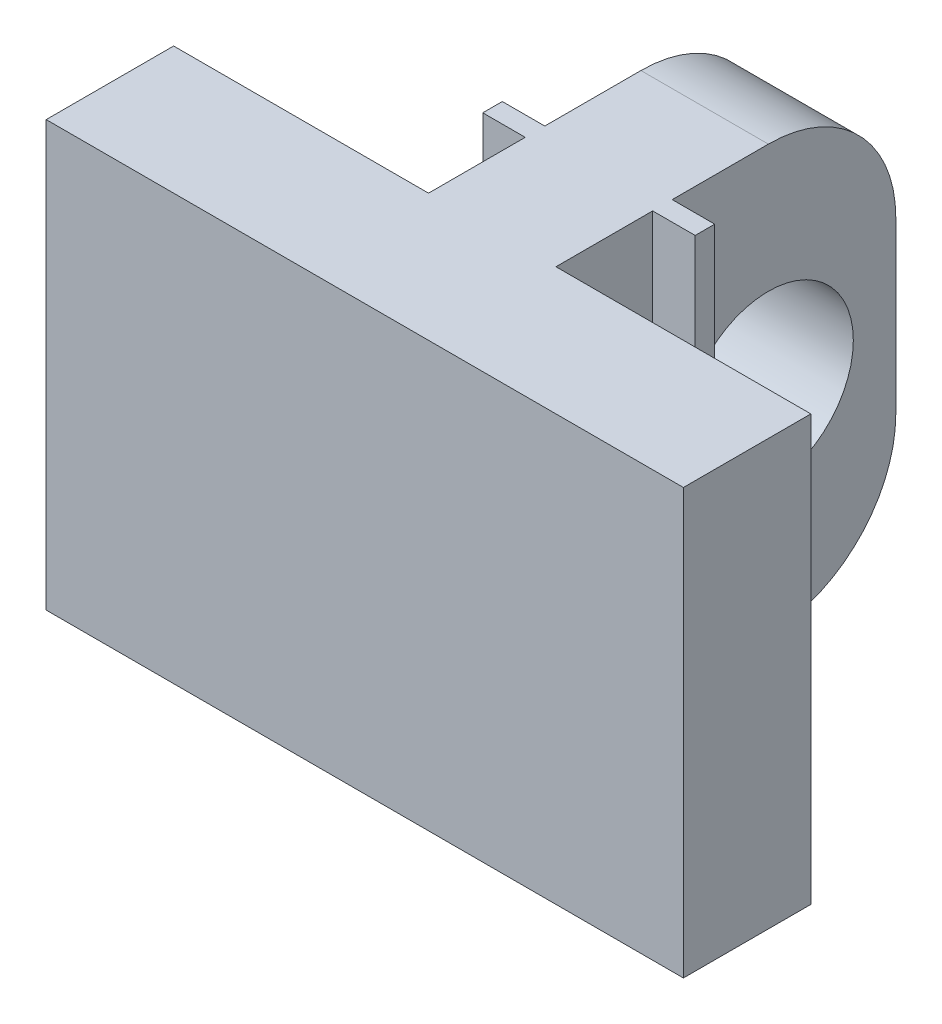
ISO-10303-21;
HEADER;
FILE_DESCRIPTION(('STEP AP214'),'2;1');
FILE_NAME('part.step','',(''),(''),'','','');
FILE_SCHEMA(('AUTOMOTIVE_DESIGN { 1 0 10303 214 1 1 1 1 }'));
ENDSEC;
DATA;
#1=APPLICATION_CONTEXT('core data for automotive mechanical design processes');
#2=APPLICATION_PROTOCOL_DEFINITION('international standard','automotive_design',2000,#1);
#3=PRODUCT_CONTEXT('',#1,'mechanical');
#4=PRODUCT('Part','Part','',(#3));
#5=PRODUCT_RELATED_PRODUCT_CATEGORY('part','',(#4));
#6=PRODUCT_DEFINITION_FORMATION('','',#4);
#7=PRODUCT_DEFINITION_CONTEXT('part definition',#1,'design');
#8=PRODUCT_DEFINITION('design','',#6,#7);
#9=PRODUCT_DEFINITION_SHAPE('','',#8);
#10=(LENGTH_UNIT() NAMED_UNIT(*) SI_UNIT(.MILLI.,.METRE.));
#11=(NAMED_UNIT(*) PLANE_ANGLE_UNIT() SI_UNIT($,.RADIAN.));
#12=(NAMED_UNIT(*) SI_UNIT($,.STERADIAN.) SOLID_ANGLE_UNIT());
#13=UNCERTAINTY_MEASURE_WITH_UNIT(LENGTH_MEASURE(1.E-05),#10,'distance_accuracy_value','');
#14=(GEOMETRIC_REPRESENTATION_CONTEXT(3) GLOBAL_UNCERTAINTY_ASSIGNED_CONTEXT((#13)) GLOBAL_UNIT_ASSIGNED_CONTEXT((#10,
#11,#12)) REPRESENTATION_CONTEXT('',''));
#15=CARTESIAN_POINT('',(0.,0.,0.));
#16=DIRECTION('',(0.,0.,1.));
#17=DIRECTION('',(1.,0.,0.));
#18=AXIS2_PLACEMENT_3D('',#15,#16,#17);
#19=CARTESIAN_POINT('',(1.5,10.,0.));
#20=DIRECTION('',(1.,0.,0.));
#21=DIRECTION('',(0.,0.,-1.));
#22=AXIS2_PLACEMENT_3D('',#19,#20,#21);
#23=PLANE('',#22);
#24=DIRECTION('',(0.,1.,0.));
#25=VECTOR('',#24,1.);
#26=CARTESIAN_POINT('',(1.5,10.,-2.422407419715));
#27=LINE('',#26,#25);
#28=CARTESIAN_POINT('',(1.5,0.,-2.422407419715));
#29=VERTEX_POINT('',#28);
#30=CARTESIAN_POINT('',(1.5,10.,-2.422407419715));
#31=VERTEX_POINT('',#30);
#32=EDGE_CURVE('E166',#29,#31,#27,.T.);
#33=ORIENTED_EDGE('',*,*,#32,.F.);
#34=DIRECTION('',(0.,0.,1.));
#35=VECTOR('',#34,1.);
#36=CARTESIAN_POINT('',(1.5,0.,0.));
#37=LINE('',#36,#35);
#38=CARTESIAN_POINT('',(1.5,0.,-4.68567639257295));
#39=VERTEX_POINT('',#38);
#40=EDGE_CURVE('E246',#39,#29,#37,.T.);
#41=ORIENTED_EDGE('',*,*,#40,.F.);
#42=CARTESIAN_POINT('',(1.5,3.,-4.68567639257295));
#43=DIRECTION('',(1.,0.,0.));
#44=DIRECTION('',(0.,0.,-1.));
#45=AXIS2_PLACEMENT_3D('',#42,#43,#44);
#46=CIRCLE('',#45,3.);
#47=CARTESIAN_POINT('',(1.5,3.,-7.68567639257295));
#48=VERTEX_POINT('',#47);
#49=EDGE_CURVE('E282',#39,#48,#46,.T.);
#50=ORIENTED_EDGE('',*,*,#49,.T.);
#51=DIRECTION('',(0.,-1.,0.));
#52=VECTOR('',#51,1.);
#53=CARTESIAN_POINT('',(1.5,10.,-7.68567639257295));
#54=LINE('',#53,#52);
#55=CARTESIAN_POINT('',(1.5,7.,-7.68567639257295));
#56=VERTEX_POINT('',#55);
#57=EDGE_CURVE('E269',#56,#48,#54,.T.);
#58=ORIENTED_EDGE('',*,*,#57,.F.);
#59=CARTESIAN_POINT('',(1.5,7.,-4.68567639257295));
#60=DIRECTION('',(1.,0.,0.));
#61=DIRECTION('',(0.,0.,-1.));
#62=AXIS2_PLACEMENT_3D('',#59,#60,#61);
#63=CIRCLE('',#62,3.);
#64=CARTESIAN_POINT('',(1.5,10.,-4.68567639257295));
#65=VERTEX_POINT('',#64);
#66=EDGE_CURVE('E280',#56,#65,#63,.T.);
#67=ORIENTED_EDGE('',*,*,#66,.T.);
#68=DIRECTION('',(0.,0.,1.));
#69=VECTOR('',#68,1.);
#70=CARTESIAN_POINT('',(1.5,10.,0.));
#71=LINE('',#70,#69);
#72=EDGE_CURVE('E59',#65,#31,#71,.T.);
#73=ORIENTED_EDGE('',*,*,#72,.T.);
#74=EDGE_LOOP('',(#33,#41,#50,#58,#67,#73));
#75=FACE_BOUND('',#74,.T.);
#76=CARTESIAN_POINT('',(1.5,5.,-4.68567639257295));
#77=DIRECTION('',(1.,0.,0.));
#78=DIRECTION('',(0.,0.,-1.));
#79=AXIS2_PLACEMENT_3D('',#76,#77,#78);
#80=CIRCLE('',#79,2.);
#81=CARTESIAN_POINT('',(1.5,5.,-6.68567639257295));
#82=VERTEX_POINT('',#81);
#83=EDGE_CURVE('E216',#82,#82,#80,.T.);
#84=ORIENTED_EDGE('',*,*,#83,.F.);
#85=EDGE_LOOP('',(#84));
#86=FACE_BOUND('',#85,.T.);
#87=ADVANCED_FACE('F35',(#75,#86),#23,.T.);
#88=CARTESIAN_POINT('',(-1.5,10.,0.));
#89=DIRECTION('',(1.,0.,0.));
#90=DIRECTION('',(0.,0.,-1.));
#91=AXIS2_PLACEMENT_3D('',#88,#89,#90);
#92=PLANE('',#91);
#93=CARTESIAN_POINT('',(-1.5,5.,-4.68567639257294));
#94=DIRECTION('',(1.,0.,0.));
#95=DIRECTION('',(0.,0.,-1.));
#96=AXIS2_PLACEMENT_3D('',#93,#94,#95);
#97=CIRCLE('',#96,2.);
#98=CARTESIAN_POINT('',(-1.5,5.,-6.68567639257294));
#99=VERTEX_POINT('',#98);
#100=EDGE_CURVE('E39',#99,#99,#97,.T.);
#101=ORIENTED_EDGE('',*,*,#100,.T.);
#102=EDGE_LOOP('',(#101));
#103=FACE_BOUND('',#102,.T.);
#104=DIRECTION('',(0.,0.,1.));
#105=VECTOR('',#104,1.);
#106=CARTESIAN_POINT('',(-1.5,0.,0.));
#107=LINE('',#106,#105);
#108=CARTESIAN_POINT('',(-1.5,0.,-4.68567639257295));
#109=VERTEX_POINT('',#108);
#110=CARTESIAN_POINT('',(-1.5,0.,-2.422407419715));
#111=VERTEX_POINT('',#110);
#112=EDGE_CURVE('E250',#109,#111,#107,.T.);
#113=ORIENTED_EDGE('',*,*,#112,.T.);
#114=DIRECTION('',(0.,1.,0.));
#115=VECTOR('',#114,1.);
#116=CARTESIAN_POINT('',(-1.5,10.,-2.422407419715));
#117=LINE('',#116,#115);
#118=CARTESIAN_POINT('',(-1.5,10.,-2.422407419715));
#119=VERTEX_POINT('',#118);
#120=EDGE_CURVE('E212',#111,#119,#117,.T.);
#121=ORIENTED_EDGE('',*,*,#120,.T.);
#122=DIRECTION('',(0.,0.,1.));
#123=VECTOR('',#122,1.);
#124=CARTESIAN_POINT('',(-1.5,10.,0.));
#125=LINE('',#124,#123);
#126=CARTESIAN_POINT('',(-1.5,10.,-4.68567639257295));
#127=VERTEX_POINT('',#126);
#128=EDGE_CURVE('E230',#127,#119,#125,.T.);
#129=ORIENTED_EDGE('',*,*,#128,.F.);
#130=CARTESIAN_POINT('',(-1.5,7.,-4.68567639257295));
#131=DIRECTION('',(1.,0.,0.));
#132=DIRECTION('',(0.,0.,-1.));
#133=AXIS2_PLACEMENT_3D('',#130,#131,#132);
#134=CIRCLE('',#133,3.);
#135=CARTESIAN_POINT('',(-1.5,7.,-7.68567639257295));
#136=VERTEX_POINT('',#135);
#137=EDGE_CURVE('E289',#127,#136,#134,.F.);
#138=ORIENTED_EDGE('',*,*,#137,.T.);
#139=DIRECTION('',(0.,-1.,0.));
#140=VECTOR('',#139,1.);
#141=CARTESIAN_POINT('',(-1.5,10.,-7.68567639257295));
#142=LINE('',#141,#140);
#143=CARTESIAN_POINT('',(-1.5,3.,-7.68567639257295));
#144=VERTEX_POINT('',#143);
#145=EDGE_CURVE('E266',#136,#144,#142,.T.);
#146=ORIENTED_EDGE('',*,*,#145,.T.);
#147=CARTESIAN_POINT('',(-1.5,3.,-4.68567639257295));
#148=DIRECTION('',(1.,0.,0.));
#149=DIRECTION('',(0.,0.,-1.));
#150=AXIS2_PLACEMENT_3D('',#147,#148,#149);
#151=CIRCLE('',#150,3.);
#152=EDGE_CURVE('E44',#144,#109,#151,.F.);
#153=ORIENTED_EDGE('',*,*,#152,.T.);
#154=EDGE_LOOP('',(#113,#121,#129,#138,#146,#153));
#155=FACE_BOUND('',#154,.T.);
#156=ADVANCED_FACE('F294',(#103,#155),#92,.F.);
#157=CARTESIAN_POINT('',(7.5,10.,0.));
#158=DIRECTION('',(1.,0.,0.));
#159=DIRECTION('',(0.,0.,-1.));
#160=AXIS2_PLACEMENT_3D('',#157,#158,#159);
#161=PLANE('',#160);
#162=DIRECTION('',(0.,0.,1.));
#163=VECTOR('',#162,1.);
#164=CARTESIAN_POINT('',(7.5,0.,0.));
#165=LINE('',#164,#163);
#166=CARTESIAN_POINT('',(7.5,0.,0.314323607427055));
#167=VERTEX_POINT('',#166);
#168=CARTESIAN_POINT('',(7.5,0.,3.31432360742705));
#169=VERTEX_POINT('',#168);
#170=EDGE_CURVE('E238',#167,#169,#165,.T.);
#171=ORIENTED_EDGE('',*,*,#170,.F.);
#172=DIRECTION('',(0.,-1.,0.));
#173=VECTOR('',#172,1.);
#174=CARTESIAN_POINT('',(7.5,10.,0.314323607427055));
#175=LINE('',#174,#173);
#176=CARTESIAN_POINT('',(7.5,10.,0.314323607427055));
#177=VERTEX_POINT('',#176);
#178=EDGE_CURVE('E275',#177,#167,#175,.T.);
#179=ORIENTED_EDGE('',*,*,#178,.F.);
#180=DIRECTION('',(0.,0.,1.));
#181=VECTOR('',#180,1.);
#182=CARTESIAN_POINT('',(7.5,10.,0.));
#183=LINE('',#182,#181);
#184=CARTESIAN_POINT('',(7.5,10.,3.31432360742705));
#185=VERTEX_POINT('',#184);
#186=EDGE_CURVE('E219',#177,#185,#183,.T.);
#187=ORIENTED_EDGE('',*,*,#186,.T.);
#188=DIRECTION('',(0.,-1.,0.));
#189=VECTOR('',#188,1.);
#190=CARTESIAN_POINT('',(7.5,10.,3.31432360742705));
#191=LINE('',#190,#189);
#192=EDGE_CURVE('E237',#185,#169,#191,.T.);
#193=ORIENTED_EDGE('',*,*,#192,.T.);
#194=EDGE_LOOP('',(#171,#179,#187,#193));
#195=FACE_BOUND('',#194,.T.);
#196=ADVANCED_FACE('F357',(#195),#161,.T.);
#197=CARTESIAN_POINT('',(0.,10.,0.314323607427055));
#198=DIRECTION('',(0.,0.,-1.));
#199=DIRECTION('',(-1.,0.,0.));
#200=AXIS2_PLACEMENT_3D('',#197,#198,#199);
#201=PLANE('',#200);
#202=DIRECTION('',(1.,0.,0.));
#203=VECTOR('',#202,1.);
#204=CARTESIAN_POINT('',(0.,0.,0.314323607427055));
#205=LINE('',#204,#203);
#206=CARTESIAN_POINT('',(1.5,0.,0.314323607427055));
#207=VERTEX_POINT('',#206);
#208=EDGE_CURVE('E241',#207,#167,#205,.T.);
#209=ORIENTED_EDGE('',*,*,#208,.F.);
#210=DIRECTION('',(0.,-1.,0.));
#211=VECTOR('',#210,1.);
#212=CARTESIAN_POINT('',(1.5,10.,0.314323607427055));
#213=LINE('',#212,#211);
#214=CARTESIAN_POINT('',(1.5,10.,0.314323607427055));
#215=VERTEX_POINT('',#214);
#216=EDGE_CURVE('E272',#215,#207,#213,.T.);
#217=ORIENTED_EDGE('',*,*,#216,.F.);
#218=DIRECTION('',(1.,0.,0.));
#219=VECTOR('',#218,1.);
#220=CARTESIAN_POINT('',(0.,10.,0.314323607427055));
#221=LINE('',#220,#219);
#222=EDGE_CURVE('E222',#215,#177,#221,.T.);
#223=ORIENTED_EDGE('',*,*,#222,.T.);
#224=ORIENTED_EDGE('',*,*,#178,.T.);
#225=EDGE_LOOP('',(#209,#217,#223,#224));
#226=FACE_BOUND('',#225,.T.);
#227=ADVANCED_FACE('F349',(#226),#201,.T.);
#228=DIRECTION('',(0.,-1.,0.));
#229=VECTOR('',#228,1.);
#230=CARTESIAN_POINT('',(1.5,10.,-1.9623538486826));
#231=LINE('',#230,#229);
#232=CARTESIAN_POINT('',(1.5,10.,-1.9623538486826));
#233=VERTEX_POINT('',#232);
#234=CARTESIAN_POINT('',(1.5,0.,-1.9623538486826));
#235=VERTEX_POINT('',#234);
#236=EDGE_CURVE('E209',#233,#235,#231,.T.);
#237=ORIENTED_EDGE('',*,*,#236,.F.);
#238=EDGE_CURVE('E226',#233,#215,#71,.T.);
#239=ORIENTED_EDGE('',*,*,#238,.T.);
#240=ORIENTED_EDGE('',*,*,#216,.T.);
#241=EDGE_CURVE('E244',#235,#207,#37,.T.);
#242=ORIENTED_EDGE('',*,*,#241,.F.);
#243=EDGE_LOOP('',(#237,#239,#240,#242));
#244=FACE_BOUND('',#243,.T.);
#245=ADVANCED_FACE('F353',(#244),#23,.T.);
#246=CARTESIAN_POINT('',(0.,10.,-7.68567639257295));
#247=DIRECTION('',(0.,0.,-1.));
#248=DIRECTION('',(-1.,0.,0.));
#249=AXIS2_PLACEMENT_3D('',#246,#247,#248);
#250=PLANE('',#249);
#251=ORIENTED_EDGE('',*,*,#57,.T.);
#252=DIRECTION('',(1.,0.,0.));
#253=VECTOR('',#252,1.);
#254=CARTESIAN_POINT('',(-1.5,3.,-7.68567639257295));
#255=LINE('',#254,#253);
#256=EDGE_CURVE('E287',#48,#144,#255,.F.);
#257=ORIENTED_EDGE('',*,*,#256,.T.);
#258=ORIENTED_EDGE('',*,*,#145,.F.);
#259=DIRECTION('',(1.,0.,0.));
#260=VECTOR('',#259,1.);
#261=CARTESIAN_POINT('',(0.,7.,-7.68567639257295));
#262=LINE('',#261,#260);
#263=EDGE_CURVE('E284',#136,#56,#262,.T.);
#264=ORIENTED_EDGE('',*,*,#263,.T.);
#265=EDGE_LOOP('',(#251,#257,#258,#264));
#266=FACE_BOUND('',#265,.T.);
#267=ADVANCED_FACE('F307',(#266),#250,.T.);
#268=CARTESIAN_POINT('',(-1.5,10.,-1.9623538486826));
#269=VERTEX_POINT('',#268);
#270=CARTESIAN_POINT('',(-1.5,10.,0.314323607427055));
#271=VERTEX_POINT('',#270);
#272=EDGE_CURVE('E229',#269,#271,#125,.T.);
#273=ORIENTED_EDGE('',*,*,#272,.F.);
#274=DIRECTION('',(0.,-1.,0.));
#275=VECTOR('',#274,1.);
#276=CARTESIAN_POINT('',(-1.5,10.,-1.9623538486826));
#277=LINE('',#276,#275);
#278=CARTESIAN_POINT('',(-1.5,0.,-1.9623538486826));
#279=VERTEX_POINT('',#278);
#280=EDGE_CURVE('E201',#269,#279,#277,.T.);
#281=ORIENTED_EDGE('',*,*,#280,.T.);
#282=CARTESIAN_POINT('',(-1.5,0.,0.314323607427055));
#283=VERTEX_POINT('',#282);
#284=EDGE_CURVE('E249',#279,#283,#107,.T.);
#285=ORIENTED_EDGE('',*,*,#284,.T.);
#286=DIRECTION('',(0.,-1.,0.));
#287=VECTOR('',#286,1.);
#288=CARTESIAN_POINT('',(-1.5,10.,0.314323607427055));
#289=LINE('',#288,#287);
#290=EDGE_CURVE('E263',#271,#283,#289,.T.);
#291=ORIENTED_EDGE('',*,*,#290,.F.);
#292=EDGE_LOOP('',(#273,#281,#285,#291));
#293=FACE_BOUND('',#292,.T.);
#294=ADVANCED_FACE('F326',(#293),#92,.F.);
#295=CARTESIAN_POINT('',(-7.5,0.,0.314323607427055));
#296=VERTEX_POINT('',#295);
#297=EDGE_CURVE('E245',#296,#283,#205,.T.);
#298=ORIENTED_EDGE('',*,*,#297,.F.);
#299=DIRECTION('',(0.,-1.,0.));
#300=VECTOR('',#299,1.);
#301=CARTESIAN_POINT('',(-7.5,10.,0.314323607427055));
#302=LINE('',#301,#300);
#303=CARTESIAN_POINT('',(-7.5,10.,0.314323607427055));
#304=VERTEX_POINT('',#303);
#305=EDGE_CURVE('E261',#304,#296,#302,.T.);
#306=ORIENTED_EDGE('',*,*,#305,.F.);
#307=EDGE_CURVE('E227',#304,#271,#221,.T.);
#308=ORIENTED_EDGE('',*,*,#307,.T.);
#309=ORIENTED_EDGE('',*,*,#290,.T.);
#310=EDGE_LOOP('',(#298,#306,#308,#309));
#311=FACE_BOUND('',#310,.T.);
#312=ADVANCED_FACE('F333',(#311),#201,.T.);
#313=CARTESIAN_POINT('',(-7.5,10.,0.));
#314=DIRECTION('',(1.,0.,0.));
#315=DIRECTION('',(0.,0.,-1.));
#316=AXIS2_PLACEMENT_3D('',#313,#314,#315);
#317=PLANE('',#316);
#318=DIRECTION('',(0.,0.,1.));
#319=VECTOR('',#318,1.);
#320=CARTESIAN_POINT('',(-7.5,0.,0.));
#321=LINE('',#320,#319);
#322=CARTESIAN_POINT('',(-7.5,0.,3.31432360742706));
#323=VERTEX_POINT('',#322);
#324=EDGE_CURVE('E253',#296,#323,#321,.T.);
#325=ORIENTED_EDGE('',*,*,#324,.T.);
#326=DIRECTION('',(0.,-1.,0.));
#327=VECTOR('',#326,1.);
#328=CARTESIAN_POINT('',(-7.5,10.,3.31432360742706));
#329=LINE('',#328,#327);
#330=CARTESIAN_POINT('',(-7.5,10.,3.31432360742706));
#331=VERTEX_POINT('',#330);
#332=EDGE_CURVE('E258',#331,#323,#329,.T.);
#333=ORIENTED_EDGE('',*,*,#332,.F.);
#334=DIRECTION('',(0.,0.,1.));
#335=VECTOR('',#334,1.);
#336=CARTESIAN_POINT('',(-7.5,10.,0.));
#337=LINE('',#336,#335);
#338=EDGE_CURVE('E233',#304,#331,#337,.T.);
#339=ORIENTED_EDGE('',*,*,#338,.F.);
#340=ORIENTED_EDGE('',*,*,#305,.T.);
#341=EDGE_LOOP('',(#325,#333,#339,#340));
#342=FACE_BOUND('',#341,.T.);
#343=ADVANCED_FACE('F337',(#342),#317,.F.);
#344=CARTESIAN_POINT('',(0.,10.,3.31432360742705));
#345=DIRECTION('',(0.,0.,-1.));
#346=DIRECTION('',(-1.,0.,0.));
#347=AXIS2_PLACEMENT_3D('',#344,#345,#346);
#348=PLANE('',#347);
#349=DIRECTION('',(1.,0.,0.));
#350=VECTOR('',#349,1.);
#351=CARTESIAN_POINT('',(0.,0.,3.31432360742705));
#352=LINE('',#351,#350);
#353=EDGE_CURVE('E223',#323,#169,#352,.T.);
#354=ORIENTED_EDGE('',*,*,#353,.T.);
#355=ORIENTED_EDGE('',*,*,#192,.F.);
#356=DIRECTION('',(1.,0.,0.));
#357=VECTOR('',#356,1.);
#358=CARTESIAN_POINT('',(0.,10.,3.31432360742705));
#359=LINE('',#358,#357);
#360=EDGE_CURVE('E235',#331,#185,#359,.T.);
#361=ORIENTED_EDGE('',*,*,#360,.F.);
#362=ORIENTED_EDGE('',*,*,#332,.T.);
#363=EDGE_LOOP('',(#354,#355,#361,#362));
#364=FACE_BOUND('',#363,.T.);
#365=ADVANCED_FACE('F342',(#364),#348,.F.);
#366=CARTESIAN_POINT('',(0.,10.,0.));
#367=DIRECTION('',(0.,1.,0.));
#368=DIRECTION('',(0.,0.,1.));
#369=AXIS2_PLACEMENT_3D('',#366,#367,#368);
#370=PLANE('',#369);
#371=ORIENTED_EDGE('',*,*,#238,.F.);
#372=DIRECTION('',(1.,0.,0.));
#373=VECTOR('',#372,1.);
#374=CARTESIAN_POINT('',(-2.5,10.,-1.9623538486826));
#375=LINE('',#374,#373);
#376=CARTESIAN_POINT('',(2.5,10.,-1.9623538486826));
#377=VERTEX_POINT('',#376);
#378=EDGE_CURVE('E174',#233,#377,#375,.T.);
#379=ORIENTED_EDGE('',*,*,#378,.T.);
#380=DIRECTION('',(0.,0.,1.));
#381=VECTOR('',#380,1.);
#382=CARTESIAN_POINT('',(2.5,10.,-2.422407419715));
#383=LINE('',#382,#381);
#384=CARTESIAN_POINT('',(2.5,10.,-2.422407419715));
#385=VERTEX_POINT('',#384);
#386=EDGE_CURVE('E171',#385,#377,#383,.T.);
#387=ORIENTED_EDGE('',*,*,#386,.F.);
#388=DIRECTION('',(1.,0.,0.));
#389=VECTOR('',#388,1.);
#390=CARTESIAN_POINT('',(-2.5,10.,-2.422407419715));
#391=LINE('',#390,#389);
#392=EDGE_CURVE('E160',#31,#385,#391,.T.);
#393=ORIENTED_EDGE('',*,*,#392,.F.);
#394=ORIENTED_EDGE('',*,*,#72,.F.);
#395=DIRECTION('',(1.,0.,0.));
#396=VECTOR('',#395,1.);
#397=CARTESIAN_POINT('',(0.,10.,-4.68567639257295));
#398=LINE('',#397,#396);
#399=EDGE_CURVE('E11',#65,#127,#398,.F.);
#400=ORIENTED_EDGE('',*,*,#399,.T.);
#401=ORIENTED_EDGE('',*,*,#128,.T.);
#402=CARTESIAN_POINT('',(-2.5,10.,-2.422407419715));
#403=VERTEX_POINT('',#402);
#404=EDGE_CURVE('E167',#403,#119,#391,.T.);
#405=ORIENTED_EDGE('',*,*,#404,.F.);
#406=DIRECTION('',(0.,0.,1.));
#407=VECTOR('',#406,1.);
#408=CARTESIAN_POINT('',(-2.5,10.,-2.422407419715));
#409=LINE('',#408,#407);
#410=CARTESIAN_POINT('',(-2.5,10.,-1.9623538486826));
#411=VERTEX_POINT('',#410);
#412=EDGE_CURVE('E191',#403,#411,#409,.T.);
#413=ORIENTED_EDGE('',*,*,#412,.T.);
#414=EDGE_CURVE('E51',#411,#269,#375,.T.);
#415=ORIENTED_EDGE('',*,*,#414,.T.);
#416=ORIENTED_EDGE('',*,*,#272,.T.);
#417=ORIENTED_EDGE('',*,*,#307,.F.);
#418=ORIENTED_EDGE('',*,*,#338,.T.);
#419=ORIENTED_EDGE('',*,*,#360,.T.);
#420=ORIENTED_EDGE('',*,*,#186,.F.);
#421=ORIENTED_EDGE('',*,*,#222,.F.);
#422=EDGE_LOOP('',(#371,#379,#387,#393,#394,#400,#401,#405,#413,#415,#416,#417,#418,#419,#420,#421));
#423=FACE_BOUND('',#422,.T.);
#424=ADVANCED_FACE('F172',(#423),#370,.T.);
#425=CARTESIAN_POINT('',(0.,0.,0.));
#426=DIRECTION('',(0.,1.,0.));
#427=DIRECTION('',(0.,0.,1.));
#428=AXIS2_PLACEMENT_3D('',#425,#426,#427);
#429=PLANE('',#428);
#430=ORIENTED_EDGE('',*,*,#284,.F.);
#431=DIRECTION('',(1.,0.,0.));
#432=VECTOR('',#431,1.);
#433=CARTESIAN_POINT('',(-2.5,0.,-1.9623538486826));
#434=LINE('',#433,#432);
#435=CARTESIAN_POINT('',(-2.5,0.,-1.9623538486826));
#436=VERTEX_POINT('',#435);
#437=EDGE_CURVE('E203',#436,#279,#434,.T.);
#438=ORIENTED_EDGE('',*,*,#437,.F.);
#439=DIRECTION('',(0.,0.,-1.));
#440=VECTOR('',#439,1.);
#441=CARTESIAN_POINT('',(-2.5,0.,-2.422407419715));
#442=LINE('',#441,#440);
#443=CARTESIAN_POINT('',(-2.5,0.,-2.422407419715));
#444=VERTEX_POINT('',#443);
#445=EDGE_CURVE('E168',#436,#444,#442,.T.);
#446=ORIENTED_EDGE('',*,*,#445,.T.);
#447=DIRECTION('',(1.,0.,0.));
#448=VECTOR('',#447,1.);
#449=CARTESIAN_POINT('',(-2.5,0.,-2.422407419715));
#450=LINE('',#449,#448);
#451=EDGE_CURVE('E198',#444,#111,#450,.T.);
#452=ORIENTED_EDGE('',*,*,#451,.T.);
#453=ORIENTED_EDGE('',*,*,#112,.F.);
#454=DIRECTION('',(1.,0.,0.));
#455=VECTOR('',#454,1.);
#456=CARTESIAN_POINT('',(1.5,0.,-4.68567639257295));
#457=LINE('',#456,#455);
#458=EDGE_CURVE('E277',#109,#39,#457,.T.);
#459=ORIENTED_EDGE('',*,*,#458,.T.);
#460=ORIENTED_EDGE('',*,*,#40,.T.);
#461=CARTESIAN_POINT('',(2.5,0.,-2.422407419715));
#462=VERTEX_POINT('',#461);
#463=EDGE_CURVE('E202',#29,#462,#450,.T.);
#464=ORIENTED_EDGE('',*,*,#463,.T.);
#465=DIRECTION('',(0.,0.,-1.));
#466=VECTOR('',#465,1.);
#467=CARTESIAN_POINT('',(2.5,0.,-2.422407419715));
#468=LINE('',#467,#466);
#469=CARTESIAN_POINT('',(2.5,0.,-1.9623538486826));
#470=VERTEX_POINT('',#469);
#471=EDGE_CURVE('E183',#470,#462,#468,.T.);
#472=ORIENTED_EDGE('',*,*,#471,.F.);
#473=EDGE_CURVE('E205',#235,#470,#434,.T.);
#474=ORIENTED_EDGE('',*,*,#473,.F.);
#475=ORIENTED_EDGE('',*,*,#241,.T.);
#476=ORIENTED_EDGE('',*,*,#208,.T.);
#477=ORIENTED_EDGE('',*,*,#170,.T.);
#478=ORIENTED_EDGE('',*,*,#353,.F.);
#479=ORIENTED_EDGE('',*,*,#324,.F.);
#480=ORIENTED_EDGE('',*,*,#297,.T.);
#481=EDGE_LOOP('',(#430,#438,#446,#452,#453,#459,#460,#464,#472,#474,#475,#476,#477,#478,#479,#480));
#482=FACE_BOUND('',#481,.T.);
#483=ADVANCED_FACE('F301',(#482),#429,.F.);
#484=CARTESIAN_POINT('',(0.,3.,-4.68567639257295));
#485=DIRECTION('',(-1.,0.,0.));
#486=DIRECTION('',(0.,0.,1.));
#487=AXIS2_PLACEMENT_3D('',#484,#485,#486);
#488=CYLINDRICAL_SURFACE('',#487,3.);
#489=ORIENTED_EDGE('',*,*,#152,.F.);
#490=ORIENTED_EDGE('',*,*,#256,.F.);
#491=ORIENTED_EDGE('',*,*,#49,.F.);
#492=ORIENTED_EDGE('',*,*,#458,.F.);
#493=EDGE_LOOP('',(#489,#490,#491,#492));
#494=FACE_BOUND('',#493,.T.);
#495=ADVANCED_FACE('F303',(#494),#488,.T.);
#496=CARTESIAN_POINT('',(0.,7.,-4.68567639257295));
#497=DIRECTION('',(1.,0.,0.));
#498=DIRECTION('',(0.,0.,-1.));
#499=AXIS2_PLACEMENT_3D('',#496,#497,#498);
#500=CYLINDRICAL_SURFACE('',#499,3.);
#501=ORIENTED_EDGE('',*,*,#137,.F.);
#502=ORIENTED_EDGE('',*,*,#399,.F.);
#503=ORIENTED_EDGE('',*,*,#66,.F.);
#504=ORIENTED_EDGE('',*,*,#263,.F.);
#505=EDGE_LOOP('',(#501,#502,#503,#504));
#506=FACE_BOUND('',#505,.T.);
#507=ADVANCED_FACE('F37',(#506),#500,.T.);
#508=CARTESIAN_POINT('',(-8.5,5.,-4.68567639257294));
#509=DIRECTION('',(1.,0.,0.));
#510=DIRECTION('',(0.,0.,-1.));
#511=AXIS2_PLACEMENT_3D('',#508,#509,#510);
#512=CYLINDRICAL_SURFACE('',#511,2.);
#513=ORIENTED_EDGE('',*,*,#83,.T.);
#514=EDGE_LOOP('',(#513));
#515=FACE_BOUND('',#514,.T.);
#516=ORIENTED_EDGE('',*,*,#100,.F.);
#517=EDGE_LOOP('',(#516));
#518=FACE_BOUND('',#517,.T.);
#519=ADVANCED_FACE('F391',(#515,#518),#512,.F.);
#520=CARTESIAN_POINT('',(-2.5,0.,0.));
#521=DIRECTION('',(-1.,0.,0.));
#522=DIRECTION('',(0.,0.,1.));
#523=AXIS2_PLACEMENT_3D('',#520,#521,#522);
#524=PLANE('',#523);
#525=DIRECTION('',(0.,1.,0.));
#526=VECTOR('',#525,1.);
#527=CARTESIAN_POINT('',(-2.5,10.,-2.422407419715));
#528=LINE('',#527,#526);
#529=EDGE_CURVE('E188',#444,#403,#528,.T.);
#530=ORIENTED_EDGE('',*,*,#529,.F.);
#531=ORIENTED_EDGE('',*,*,#445,.F.);
#532=DIRECTION('',(0.,-1.,0.));
#533=VECTOR('',#532,1.);
#534=CARTESIAN_POINT('',(-2.5,10.,-1.9623538486826));
#535=LINE('',#534,#533);
#536=EDGE_CURVE('E193',#411,#436,#535,.T.);
#537=ORIENTED_EDGE('',*,*,#536,.F.);
#538=ORIENTED_EDGE('',*,*,#412,.F.);
#539=EDGE_LOOP('',(#530,#531,#537,#538));
#540=FACE_BOUND('',#539,.T.);
#541=ADVANCED_FACE('F319',(#540),#524,.T.);
#542=CARTESIAN_POINT('',(-2.5,10.,-1.9623538486826));
#543=DIRECTION('',(0.,0.,1.));
#544=DIRECTION('',(1.,0.,0.));
#545=AXIS2_PLACEMENT_3D('',#542,#543,#544);
#546=PLANE('',#545);
#547=ORIENTED_EDGE('',*,*,#280,.F.);
#548=ORIENTED_EDGE('',*,*,#414,.F.);
#549=ORIENTED_EDGE('',*,*,#536,.T.);
#550=ORIENTED_EDGE('',*,*,#437,.T.);
#551=EDGE_LOOP('',(#547,#548,#549,#550));
#552=FACE_BOUND('',#551,.T.);
#553=ADVANCED_FACE('F322',(#552),#546,.T.);
#554=CARTESIAN_POINT('',(-2.5,10.,-2.422407419715));
#555=DIRECTION('',(0.,0.,-1.));
#556=DIRECTION('',(-1.,0.,0.));
#557=AXIS2_PLACEMENT_3D('',#554,#555,#556);
#558=PLANE('',#557);
#559=ORIENTED_EDGE('',*,*,#120,.F.);
#560=ORIENTED_EDGE('',*,*,#451,.F.);
#561=ORIENTED_EDGE('',*,*,#529,.T.);
#562=ORIENTED_EDGE('',*,*,#404,.T.);
#563=EDGE_LOOP('',(#559,#560,#561,#562));
#564=FACE_BOUND('',#563,.T.);
#565=ADVANCED_FACE('F314',(#564),#558,.T.);
#566=ORIENTED_EDGE('',*,*,#463,.F.);
#567=ORIENTED_EDGE('',*,*,#32,.T.);
#568=ORIENTED_EDGE('',*,*,#392,.T.);
#569=DIRECTION('',(0.,1.,0.));
#570=VECTOR('',#569,1.);
#571=CARTESIAN_POINT('',(2.5,10.,-2.422407419715));
#572=LINE('',#571,#570);
#573=EDGE_CURVE('E165',#462,#385,#572,.T.);
#574=ORIENTED_EDGE('',*,*,#573,.F.);
#575=EDGE_LOOP('',(#566,#567,#568,#574));
#576=FACE_BOUND('',#575,.T.);
#577=ADVANCED_FACE('F163',(#576),#558,.T.);
#578=ORIENTED_EDGE('',*,*,#378,.F.);
#579=ORIENTED_EDGE('',*,*,#236,.T.);
#580=ORIENTED_EDGE('',*,*,#473,.T.);
#581=DIRECTION('',(0.,-1.,0.));
#582=VECTOR('',#581,1.);
#583=CARTESIAN_POINT('',(2.5,10.,-1.9623538486826));
#584=LINE('',#583,#582);
#585=EDGE_CURVE('E178',#377,#470,#584,.T.);
#586=ORIENTED_EDGE('',*,*,#585,.F.);
#587=EDGE_LOOP('',(#578,#579,#580,#586));
#588=FACE_BOUND('',#587,.T.);
#589=ADVANCED_FACE('F356',(#588),#546,.T.);
#590=CARTESIAN_POINT('',(2.5,0.,0.));
#591=DIRECTION('',(-1.,0.,0.));
#592=DIRECTION('',(0.,0.,1.));
#593=AXIS2_PLACEMENT_3D('',#590,#591,#592);
#594=PLANE('',#593);
#595=ORIENTED_EDGE('',*,*,#573,.T.);
#596=ORIENTED_EDGE('',*,*,#386,.T.);
#597=ORIENTED_EDGE('',*,*,#585,.T.);
#598=ORIENTED_EDGE('',*,*,#471,.T.);
#599=EDGE_LOOP('',(#595,#596,#597,#598));
#600=FACE_BOUND('',#599,.T.);
#601=ADVANCED_FACE('F181',(#600),#594,.F.);
#602=CLOSED_SHELL('',(#87,#156,#196,#227,#245,#267,#294,#312,#343,#365,#424,#483,#495,#507,#519,
#541,#553,#565,#577,#589,#601));
#603=MANIFOLD_SOLID_BREP('B2',#602);
#604=ADVANCED_BREP_SHAPE_REPRESENTATION('',(#18,#603),#14);
#605=SHAPE_DEFINITION_REPRESENTATION(#9,#604);
ENDSEC;
END-ISO-10303-21;
